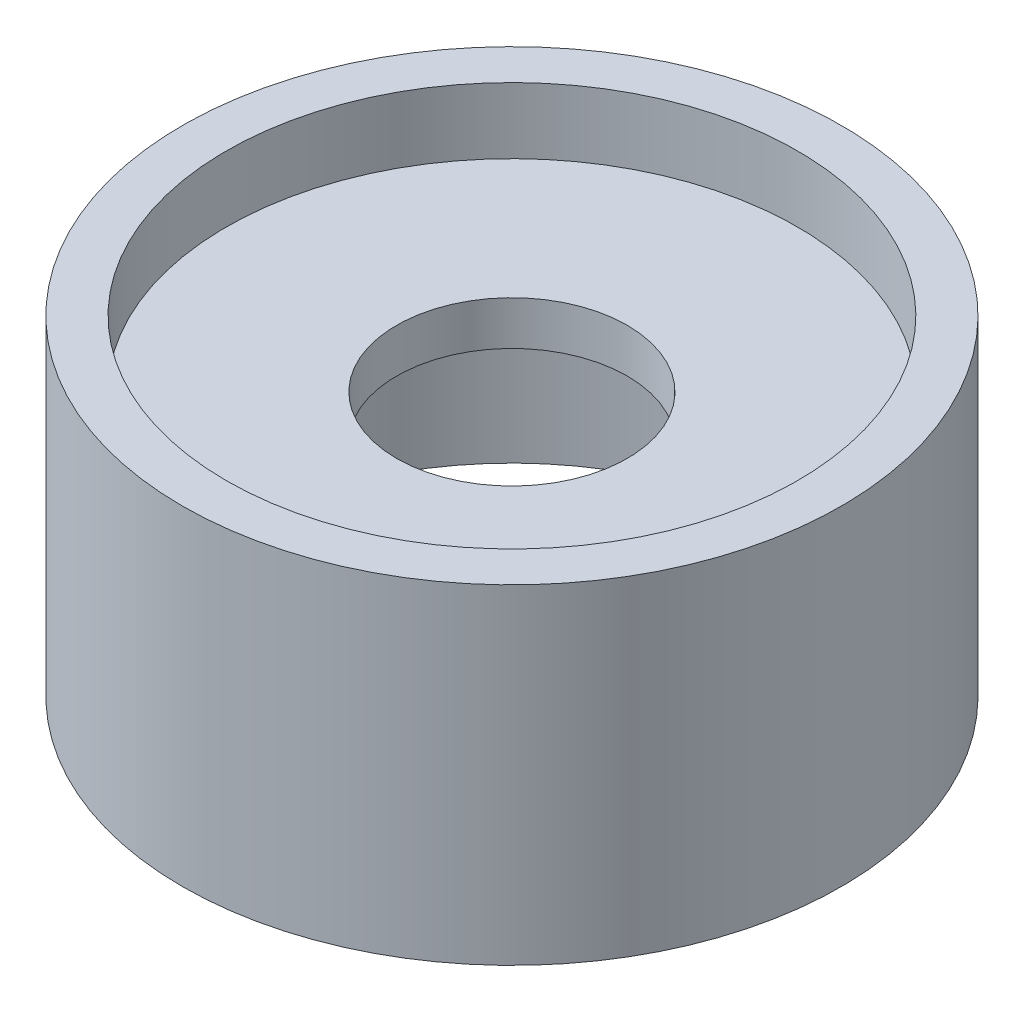
ISO-10303-21;
HEADER;
FILE_DESCRIPTION(('STEP AP214'),'2;1');
FILE_NAME('part.step','',(''),(''),'','','');
FILE_SCHEMA(('AUTOMOTIVE_DESIGN { 1 0 10303 214 1 1 1 1 }'));
ENDSEC;
DATA;
#1=APPLICATION_CONTEXT('core data for automotive mechanical design processes');
#2=APPLICATION_PROTOCOL_DEFINITION('international standard','automotive_design',2000,#1);
#3=PRODUCT_CONTEXT('',#1,'mechanical');
#4=PRODUCT('Part','Part','',(#3));
#5=PRODUCT_RELATED_PRODUCT_CATEGORY('part','',(#4));
#6=PRODUCT_DEFINITION_FORMATION('','',#4);
#7=PRODUCT_DEFINITION_CONTEXT('part definition',#1,'design');
#8=PRODUCT_DEFINITION('design','',#6,#7);
#9=PRODUCT_DEFINITION_SHAPE('','',#8);
#10=(LENGTH_UNIT() NAMED_UNIT(*) SI_UNIT(.MILLI.,.METRE.));
#11=(NAMED_UNIT(*) PLANE_ANGLE_UNIT() SI_UNIT($,.RADIAN.));
#12=(NAMED_UNIT(*) SI_UNIT($,.STERADIAN.) SOLID_ANGLE_UNIT());
#13=UNCERTAINTY_MEASURE_WITH_UNIT(LENGTH_MEASURE(1.E-05),#10,'distance_accuracy_value','');
#14=(GEOMETRIC_REPRESENTATION_CONTEXT(3) GLOBAL_UNCERTAINTY_ASSIGNED_CONTEXT((#13)) GLOBAL_UNIT_ASSIGNED_CONTEXT((#10,
#11,#12)) REPRESENTATION_CONTEXT('',''));
#15=CARTESIAN_POINT('',(0.,0.,0.));
#16=DIRECTION('',(0.,0.,1.));
#17=DIRECTION('',(1.,0.,0.));
#18=AXIS2_PLACEMENT_3D('',#15,#16,#17);
#19=CARTESIAN_POINT('',(0.,-10.,0.));
#20=DIRECTION('',(0.,1.,0.));
#21=DIRECTION('',(0.,0.,1.));
#22=AXIS2_PLACEMENT_3D('',#19,#20,#21);
#23=CYLINDRICAL_SURFACE('',#22,13.);
#24=CARTESIAN_POINT('',(0.,-10.,0.));
#25=DIRECTION('',(0.,1.,0.));
#26=DIRECTION('',(0.,0.,1.));
#27=AXIS2_PLACEMENT_3D('',#24,#25,#26);
#28=CIRCLE('',#27,13.);
#29=CARTESIAN_POINT('',(0.,-10.,13.));
#30=VERTEX_POINT('',#29);
#31=EDGE_CURVE('E54',#30,#30,#28,.T.);
#32=ORIENTED_EDGE('',*,*,#31,.F.);
#33=EDGE_LOOP('',(#32));
#34=FACE_BOUND('',#33,.T.);
#35=CARTESIAN_POINT('',(0.,0.,0.));
#36=DIRECTION('',(0.,1.,0.));
#37=DIRECTION('',(0.,0.,1.));
#38=AXIS2_PLACEMENT_3D('',#35,#36,#37);
#39=CIRCLE('',#38,13.);
#40=CARTESIAN_POINT('',(0.,0.,13.));
#41=VERTEX_POINT('',#40);
#42=EDGE_CURVE('E10',#41,#41,#39,.F.);
#43=ORIENTED_EDGE('',*,*,#42,.F.);
#44=EDGE_LOOP('',(#43));
#45=FACE_BOUND('',#44,.T.);
#46=ADVANCED_FACE('F41',(#34,#45),#23,.F.);
#47=CARTESIAN_POINT('',(0.,-10.,0.));
#48=DIRECTION('',(0.,1.,0.));
#49=DIRECTION('',(0.,0.,1.));
#50=AXIS2_PLACEMENT_3D('',#47,#48,#49);
#51=CYLINDRICAL_SURFACE('',#50,15.);
#52=CARTESIAN_POINT('',(0.,5.,0.));
#53=DIRECTION('',(0.,1.,0.));
#54=DIRECTION('',(0.,0.,1.));
#55=AXIS2_PLACEMENT_3D('',#52,#53,#54);
#56=CIRCLE('',#55,15.);
#57=CARTESIAN_POINT('',(0.,5.,15.));
#58=VERTEX_POINT('',#57);
#59=EDGE_CURVE('E64',#58,#58,#56,.T.);
#60=ORIENTED_EDGE('',*,*,#59,.F.);
#61=EDGE_LOOP('',(#60));
#62=FACE_BOUND('',#61,.T.);
#63=CARTESIAN_POINT('',(0.,-10.,0.));
#64=DIRECTION('',(0.,1.,0.));
#65=DIRECTION('',(0.,0.,1.));
#66=AXIS2_PLACEMENT_3D('',#63,#64,#65);
#67=CIRCLE('',#66,15.);
#68=CARTESIAN_POINT('',(0.,-10.,15.));
#69=VERTEX_POINT('',#68);
#70=EDGE_CURVE('E49',#69,#69,#67,.T.);
#71=ORIENTED_EDGE('',*,*,#70,.T.);
#72=EDGE_LOOP('',(#71));
#73=FACE_BOUND('',#72,.T.);
#74=ADVANCED_FACE('F43',(#62,#73),#51,.T.);
#75=CARTESIAN_POINT('',(0.,-10.,0.));
#76=DIRECTION('',(0.,1.,0.));
#77=DIRECTION('',(0.,0.,1.));
#78=AXIS2_PLACEMENT_3D('',#75,#76,#77);
#79=PLANE('',#78);
#80=ORIENTED_EDGE('',*,*,#31,.T.);
#81=EDGE_LOOP('',(#80));
#82=FACE_BOUND('',#81,.T.);
#83=ORIENTED_EDGE('',*,*,#70,.F.);
#84=EDGE_LOOP('',(#83));
#85=FACE_BOUND('',#84,.T.);
#86=ADVANCED_FACE('F76',(#82,#85),#79,.F.);
#87=CARTESIAN_POINT('',(0.,2.,0.));
#88=DIRECTION('',(0.,1.,0.));
#89=DIRECTION('',(0.,0.,1.));
#90=AXIS2_PLACEMENT_3D('',#87,#88,#89);
#91=CIRCLE('',#90,13.);
#92=CARTESIAN_POINT('',(0.,2.,13.));
#93=VERTEX_POINT('',#92);
#94=EDGE_CURVE('E57',#93,#93,#91,.F.);
#95=ORIENTED_EDGE('',*,*,#94,.T.);
#96=EDGE_LOOP('',(#95));
#97=FACE_BOUND('',#96,.T.);
#98=CARTESIAN_POINT('',(0.,5.,0.));
#99=DIRECTION('',(0.,1.,0.));
#100=DIRECTION('',(0.,0.,1.));
#101=AXIS2_PLACEMENT_3D('',#98,#99,#100);
#102=CIRCLE('',#101,13.);
#103=CARTESIAN_POINT('',(0.,5.,13.));
#104=VERTEX_POINT('',#103);
#105=EDGE_CURVE('E59',#104,#104,#102,.T.);
#106=ORIENTED_EDGE('',*,*,#105,.T.);
#107=EDGE_LOOP('',(#106));
#108=FACE_BOUND('',#107,.T.);
#109=ADVANCED_FACE('F82',(#97,#108),#23,.F.);
#110=CARTESIAN_POINT('',(0.,5.,0.));
#111=DIRECTION('',(0.,1.,0.));
#112=DIRECTION('',(0.,0.,1.));
#113=AXIS2_PLACEMENT_3D('',#110,#111,#112);
#114=PLANE('',#113);
#115=ORIENTED_EDGE('',*,*,#59,.T.);
#116=EDGE_LOOP('',(#115));
#117=FACE_BOUND('',#116,.T.);
#118=ORIENTED_EDGE('',*,*,#105,.F.);
#119=EDGE_LOOP('',(#118));
#120=FACE_BOUND('',#119,.T.);
#121=ADVANCED_FACE('F90',(#117,#120),#114,.T.);
#122=CARTESIAN_POINT('',(0.,0.,0.));
#123=DIRECTION('',(0.,1.,0.));
#124=DIRECTION('',(0.,0.,1.));
#125=AXIS2_PLACEMENT_3D('',#122,#123,#124);
#126=PLANE('',#125);
#127=CARTESIAN_POINT('',(0.,0.,0.));
#128=DIRECTION('',(0.,1.,0.));
#129=DIRECTION('',(0.,0.,1.));
#130=AXIS2_PLACEMENT_3D('',#127,#128,#129);
#131=CIRCLE('',#130,5.25);
#132=CARTESIAN_POINT('',(0.,0.,5.25));
#133=VERTEX_POINT('',#132);
#134=EDGE_CURVE('E60',#133,#133,#131,.T.);
#135=ORIENTED_EDGE('',*,*,#134,.T.);
#136=EDGE_LOOP('',(#135));
#137=FACE_BOUND('',#136,.T.);
#138=ORIENTED_EDGE('',*,*,#42,.T.);
#139=EDGE_LOOP('',(#138));
#140=FACE_BOUND('',#139,.T.);
#141=ADVANCED_FACE('F94',(#137,#140),#126,.F.);
#142=CARTESIAN_POINT('',(0.,2.,0.));
#143=DIRECTION('',(0.,1.,0.));
#144=DIRECTION('',(0.,0.,1.));
#145=AXIS2_PLACEMENT_3D('',#142,#143,#144);
#146=PLANE('',#145);
#147=CARTESIAN_POINT('',(0.,2.,0.));
#148=DIRECTION('',(0.,1.,0.));
#149=DIRECTION('',(0.,0.,1.));
#150=AXIS2_PLACEMENT_3D('',#147,#148,#149);
#151=CIRCLE('',#150,5.25);
#152=CARTESIAN_POINT('',(0.,2.,5.25));
#153=VERTEX_POINT('',#152);
#154=EDGE_CURVE('E45',#153,#153,#151,.T.);
#155=ORIENTED_EDGE('',*,*,#154,.F.);
#156=EDGE_LOOP('',(#155));
#157=FACE_BOUND('',#156,.T.);
#158=ORIENTED_EDGE('',*,*,#94,.F.);
#159=EDGE_LOOP('',(#158));
#160=FACE_BOUND('',#159,.T.);
#161=ADVANCED_FACE('F124',(#157,#160),#146,.T.);
#162=CARTESIAN_POINT('',(0.,-10.,0.));
#163=DIRECTION('',(0.,1.,0.));
#164=DIRECTION('',(0.,0.,1.));
#165=AXIS2_PLACEMENT_3D('',#162,#163,#164);
#166=CYLINDRICAL_SURFACE('',#165,5.25);
#167=ORIENTED_EDGE('',*,*,#154,.T.);
#168=EDGE_LOOP('',(#167));
#169=FACE_BOUND('',#168,.T.);
#170=ORIENTED_EDGE('',*,*,#134,.F.);
#171=EDGE_LOOP('',(#170));
#172=FACE_BOUND('',#171,.T.);
#173=ADVANCED_FACE('F133',(#169,#172),#166,.F.);
#174=CLOSED_SHELL('',(#46,#74,#86,#109,#121,#141,#161,#173));
#175=MANIFOLD_SOLID_BREP('B2',#174);
#176=ADVANCED_BREP_SHAPE_REPRESENTATION('',(#18,#175),#14);
#177=SHAPE_DEFINITION_REPRESENTATION(#9,#176);
ENDSEC;
END-ISO-10303-21;
